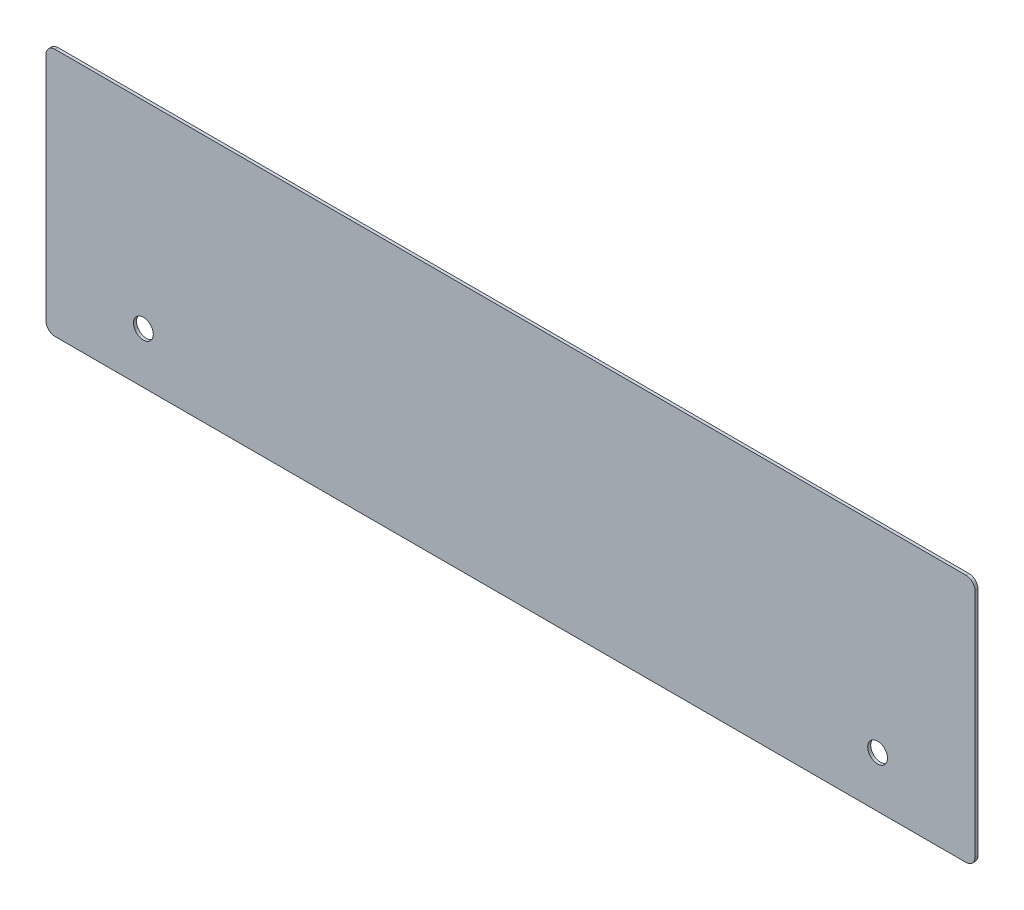
ISO-10303-21;
HEADER;
FILE_DESCRIPTION(('STEP AP214'),'2;1');
FILE_NAME('part.step','',(''),(''),'','','');
FILE_SCHEMA(('AUTOMOTIVE_DESIGN { 1 0 10303 214 1 1 1 1 }'));
ENDSEC;
DATA;
#1=APPLICATION_CONTEXT('core data for automotive mechanical design processes');
#2=APPLICATION_PROTOCOL_DEFINITION('international standard','automotive_design',2000,#1);
#3=PRODUCT_CONTEXT('',#1,'mechanical');
#4=PRODUCT('Part','Part','',(#3));
#5=PRODUCT_RELATED_PRODUCT_CATEGORY('part','',(#4));
#6=PRODUCT_DEFINITION_FORMATION('','',#4);
#7=PRODUCT_DEFINITION_CONTEXT('part definition',#1,'design');
#8=PRODUCT_DEFINITION('design','',#6,#7);
#9=PRODUCT_DEFINITION_SHAPE('','',#8);
#10=(LENGTH_UNIT() NAMED_UNIT(*) SI_UNIT(.MILLI.,.METRE.));
#11=(NAMED_UNIT(*) PLANE_ANGLE_UNIT() SI_UNIT($,.RADIAN.));
#12=(NAMED_UNIT(*) SI_UNIT($,.STERADIAN.) SOLID_ANGLE_UNIT());
#13=UNCERTAINTY_MEASURE_WITH_UNIT(LENGTH_MEASURE(1.E-05),#10,'distance_accuracy_value','');
#14=(GEOMETRIC_REPRESENTATION_CONTEXT(3) GLOBAL_UNCERTAINTY_ASSIGNED_CONTEXT((#13)) GLOBAL_UNIT_ASSIGNED_CONTEXT((#10,
#11,#12)) REPRESENTATION_CONTEXT('',''));
#15=CARTESIAN_POINT('',(0.,0.,0.));
#16=DIRECTION('',(0.,0.,1.));
#17=DIRECTION('',(1.,0.,0.));
#18=AXIS2_PLACEMENT_3D('',#15,#16,#17);
#19=CARTESIAN_POINT('',(155.,-41.5,-1.));
#20=DIRECTION('',(1.,0.,0.));
#21=DIRECTION('',(0.,0.,-1.));
#22=AXIS2_PLACEMENT_3D('',#19,#20,#21);
#23=PLANE('',#22);
#24=DIRECTION('',(0.,1.,0.));
#25=VECTOR('',#24,1.);
#26=CARTESIAN_POINT('',(155.,-41.5,0.));
#27=LINE('',#26,#25);
#28=CARTESIAN_POINT('',(155.,-38.5,0.));
#29=VERTEX_POINT('',#28);
#30=CARTESIAN_POINT('',(155.,38.5,0.));
#31=VERTEX_POINT('',#30);
#32=EDGE_CURVE('E110',#29,#31,#27,.T.);
#33=ORIENTED_EDGE('',*,*,#32,.F.);
#34=DIRECTION('',(0.,0.,1.));
#35=VECTOR('',#34,1.);
#36=CARTESIAN_POINT('',(155.,-38.5,-1.));
#37=LINE('',#36,#35);
#38=CARTESIAN_POINT('',(155.,-38.5,-1.));
#39=VERTEX_POINT('',#38);
#40=EDGE_CURVE('E11',#29,#39,#37,.F.);
#41=ORIENTED_EDGE('',*,*,#40,.T.);
#42=DIRECTION('',(0.,1.,0.));
#43=VECTOR('',#42,1.);
#44=CARTESIAN_POINT('',(155.,-41.5,-1.));
#45=LINE('',#44,#43);
#46=CARTESIAN_POINT('',(155.,38.5,-1.));
#47=VERTEX_POINT('',#46);
#48=EDGE_CURVE('E160',#39,#47,#45,.T.);
#49=ORIENTED_EDGE('',*,*,#48,.T.);
#50=DIRECTION('',(0.,0.,1.));
#51=VECTOR('',#50,1.);
#52=CARTESIAN_POINT('',(155.,38.5,-1.));
#53=LINE('',#52,#51);
#54=EDGE_CURVE('E47',#47,#31,#53,.T.);
#55=ORIENTED_EDGE('',*,*,#54,.T.);
#56=EDGE_LOOP('',(#33,#41,#49,#55));
#57=FACE_BOUND('',#56,.T.);
#58=ADVANCED_FACE('F39',(#57),#23,.T.);
#59=CARTESIAN_POINT('',(-155.,-41.5,-1.));
#60=DIRECTION('',(0.,-1.,0.));
#61=DIRECTION('',(0.,0.,-1.));
#62=AXIS2_PLACEMENT_3D('',#59,#60,#61);
#63=PLANE('',#62);
#64=DIRECTION('',(1.,0.,0.));
#65=VECTOR('',#64,1.);
#66=CARTESIAN_POINT('',(-155.,-41.5,0.));
#67=LINE('',#66,#65);
#68=CARTESIAN_POINT('',(-152.,-41.5,0.));
#69=VERTEX_POINT('',#68);
#70=CARTESIAN_POINT('',(152.,-41.5,0.));
#71=VERTEX_POINT('',#70);
#72=EDGE_CURVE('E135',#69,#71,#67,.T.);
#73=ORIENTED_EDGE('',*,*,#72,.F.);
#74=DIRECTION('',(0.,0.,1.));
#75=VECTOR('',#74,1.);
#76=CARTESIAN_POINT('',(-152.,-41.5,-1.));
#77=LINE('',#76,#75);
#78=CARTESIAN_POINT('',(-152.,-41.5,-1.));
#79=VERTEX_POINT('',#78);
#80=EDGE_CURVE('E61',#69,#79,#77,.F.);
#81=ORIENTED_EDGE('',*,*,#80,.T.);
#82=DIRECTION('',(1.,0.,0.));
#83=VECTOR('',#82,1.);
#84=CARTESIAN_POINT('',(-155.,-41.5,-1.));
#85=LINE('',#84,#83);
#86=CARTESIAN_POINT('',(152.,-41.5,-1.));
#87=VERTEX_POINT('',#86);
#88=EDGE_CURVE('E129',#79,#87,#85,.T.);
#89=ORIENTED_EDGE('',*,*,#88,.T.);
#90=DIRECTION('',(0.,0.,1.));
#91=VECTOR('',#90,1.);
#92=CARTESIAN_POINT('',(152.,-41.5,-1.));
#93=LINE('',#92,#91);
#94=EDGE_CURVE('E154',#87,#71,#93,.T.);
#95=ORIENTED_EDGE('',*,*,#94,.T.);
#96=EDGE_LOOP('',(#73,#81,#89,#95));
#97=FACE_BOUND('',#96,.T.);
#98=ADVANCED_FACE('F195',(#97),#63,.T.);
#99=CARTESIAN_POINT('',(-155.,-41.5,-1.));
#100=DIRECTION('',(-1.,0.,0.));
#101=DIRECTION('',(0.,0.,1.));
#102=AXIS2_PLACEMENT_3D('',#99,#100,#101);
#103=PLANE('',#102);
#104=DIRECTION('',(0.,-1.,0.));
#105=VECTOR('',#104,1.);
#106=CARTESIAN_POINT('',(-155.,-41.5,0.));
#107=LINE('',#106,#105);
#108=CARTESIAN_POINT('',(-155.,38.5,0.));
#109=VERTEX_POINT('',#108);
#110=CARTESIAN_POINT('',(-155.,-38.5,0.));
#111=VERTEX_POINT('',#110);
#112=EDGE_CURVE('E125',#109,#111,#107,.T.);
#113=ORIENTED_EDGE('',*,*,#112,.F.);
#114=DIRECTION('',(0.,0.,1.));
#115=VECTOR('',#114,1.);
#116=CARTESIAN_POINT('',(-155.,38.5,-1.));
#117=LINE('',#116,#115);
#118=CARTESIAN_POINT('',(-155.,38.5,-1.));
#119=VERTEX_POINT('',#118);
#120=EDGE_CURVE('E146',#109,#119,#117,.F.);
#121=ORIENTED_EDGE('',*,*,#120,.T.);
#122=DIRECTION('',(0.,-1.,0.));
#123=VECTOR('',#122,1.);
#124=CARTESIAN_POINT('',(-155.,-41.5,-1.));
#125=LINE('',#124,#123);
#126=CARTESIAN_POINT('',(-155.,-38.5,-1.));
#127=VERTEX_POINT('',#126);
#128=EDGE_CURVE('E132',#119,#127,#125,.T.);
#129=ORIENTED_EDGE('',*,*,#128,.T.);
#130=DIRECTION('',(0.,0.,1.));
#131=VECTOR('',#130,1.);
#132=CARTESIAN_POINT('',(-155.,-38.5,-1.));
#133=LINE('',#132,#131);
#134=EDGE_CURVE('E143',#127,#111,#133,.T.);
#135=ORIENTED_EDGE('',*,*,#134,.T.);
#136=EDGE_LOOP('',(#113,#121,#129,#135));
#137=FACE_BOUND('',#136,.T.);
#138=ADVANCED_FACE('F175',(#137),#103,.T.);
#139=CARTESIAN_POINT('',(-155.,41.5,-1.));
#140=DIRECTION('',(0.,1.,0.));
#141=DIRECTION('',(0.,0.,1.));
#142=AXIS2_PLACEMENT_3D('',#139,#140,#141);
#143=PLANE('',#142);
#144=DIRECTION('',(-1.,0.,0.));
#145=VECTOR('',#144,1.);
#146=CARTESIAN_POINT('',(-155.,41.5,-1.));
#147=LINE('',#146,#145);
#148=CARTESIAN_POINT('',(152.,41.5,-1.));
#149=VERTEX_POINT('',#148);
#150=CARTESIAN_POINT('',(-152.,41.5,-1.));
#151=VERTEX_POINT('',#150);
#152=EDGE_CURVE('E161',#149,#151,#147,.T.);
#153=ORIENTED_EDGE('',*,*,#152,.T.);
#154=DIRECTION('',(0.,0.,1.));
#155=VECTOR('',#154,1.);
#156=CARTESIAN_POINT('',(-152.,41.5,-1.));
#157=LINE('',#156,#155);
#158=CARTESIAN_POINT('',(-152.,41.5,0.));
#159=VERTEX_POINT('',#158);
#160=EDGE_CURVE('E116',#151,#159,#157,.T.);
#161=ORIENTED_EDGE('',*,*,#160,.T.);
#162=DIRECTION('',(-1.,0.,0.));
#163=VECTOR('',#162,1.);
#164=CARTESIAN_POINT('',(-155.,41.5,0.));
#165=LINE('',#164,#163);
#166=CARTESIAN_POINT('',(152.,41.5,0.));
#167=VERTEX_POINT('',#166);
#168=EDGE_CURVE('E108',#167,#159,#165,.T.);
#169=ORIENTED_EDGE('',*,*,#168,.F.);
#170=DIRECTION('',(0.,0.,1.));
#171=VECTOR('',#170,1.);
#172=CARTESIAN_POINT('',(152.,41.5,-1.));
#173=LINE('',#172,#171);
#174=EDGE_CURVE('E122',#167,#149,#173,.F.);
#175=ORIENTED_EDGE('',*,*,#174,.T.);
#176=EDGE_LOOP('',(#153,#161,#169,#175));
#177=FACE_BOUND('',#176,.T.);
#178=ADVANCED_FACE('F121',(#177),#143,.T.);
#179=CARTESIAN_POINT('',(0.,0.,-1.));
#180=DIRECTION('',(0.,0.,-1.));
#181=DIRECTION('',(-1.,0.,0.));
#182=AXIS2_PLACEMENT_3D('',#179,#180,#181);
#183=PLANE('',#182);
#184=CARTESIAN_POINT('',(-122.5,-24.493378467745,-0.999999999999999));
#185=DIRECTION('',(0.,0.,-1.));
#186=DIRECTION('',(-1.,0.,0.));
#187=AXIS2_PLACEMENT_3D('',#184,#185,#186);
#188=CIRCLE('',#187,3.3);
#189=CARTESIAN_POINT('',(-125.8,-24.493378467745,-0.999999999999999));
#190=VERTEX_POINT('',#189);
#191=EDGE_CURVE('E224',#190,#190,#188,.T.);
#192=ORIENTED_EDGE('',*,*,#191,.F.);
#193=EDGE_LOOP('',(#192));
#194=FACE_BOUND('',#193,.T.);
#195=CARTESIAN_POINT('',(122.5,-24.493378467745,-0.999999999999999));
#196=DIRECTION('',(0.,0.,-1.));
#197=DIRECTION('',(-1.,0.,0.));
#198=AXIS2_PLACEMENT_3D('',#195,#196,#197);
#199=CIRCLE('',#198,3.3);
#200=CARTESIAN_POINT('',(119.2,-24.493378467745,-0.999999999999999));
#201=VERTEX_POINT('',#200);
#202=EDGE_CURVE('E166',#201,#201,#199,.T.);
#203=ORIENTED_EDGE('',*,*,#202,.F.);
#204=EDGE_LOOP('',(#203));
#205=FACE_BOUND('',#204,.T.);
#206=ORIENTED_EDGE('',*,*,#128,.F.);
#207=CARTESIAN_POINT('',(-152.,38.5,-1.));
#208=DIRECTION('',(0.,0.,-1.));
#209=DIRECTION('',(-1.,0.,0.));
#210=AXIS2_PLACEMENT_3D('',#207,#208,#209);
#211=CIRCLE('',#210,3.);
#212=EDGE_CURVE('E152',#119,#151,#211,.T.);
#213=ORIENTED_EDGE('',*,*,#212,.T.);
#214=ORIENTED_EDGE('',*,*,#152,.F.);
#215=CARTESIAN_POINT('',(152.,38.5,-1.));
#216=DIRECTION('',(0.,0.,-1.));
#217=DIRECTION('',(-1.,0.,0.));
#218=AXIS2_PLACEMENT_3D('',#215,#216,#217);
#219=CIRCLE('',#218,3.);
#220=EDGE_CURVE('E128',#149,#47,#219,.T.);
#221=ORIENTED_EDGE('',*,*,#220,.T.);
#222=ORIENTED_EDGE('',*,*,#48,.F.);
#223=CARTESIAN_POINT('',(152.,-38.5,-1.));
#224=DIRECTION('',(0.,0.,-1.));
#225=DIRECTION('',(-1.,0.,0.));
#226=AXIS2_PLACEMENT_3D('',#223,#224,#225);
#227=CIRCLE('',#226,3.);
#228=EDGE_CURVE('E54',#39,#87,#227,.T.);
#229=ORIENTED_EDGE('',*,*,#228,.T.);
#230=ORIENTED_EDGE('',*,*,#88,.F.);
#231=CARTESIAN_POINT('',(-152.,-38.5,-1.));
#232=DIRECTION('',(0.,0.,-1.));
#233=DIRECTION('',(-1.,0.,0.));
#234=AXIS2_PLACEMENT_3D('',#231,#232,#233);
#235=CIRCLE('',#234,3.);
#236=EDGE_CURVE('E150',#79,#127,#235,.T.);
#237=ORIENTED_EDGE('',*,*,#236,.T.);
#238=EDGE_LOOP('',(#206,#213,#214,#221,#222,#229,#230,#237));
#239=FACE_BOUND('',#238,.T.);
#240=ADVANCED_FACE('F181',(#194,#205,#239),#183,.T.);
#241=CARTESIAN_POINT('',(0.,0.,0.));
#242=DIRECTION('',(0.,0.,-1.));
#243=DIRECTION('',(-1.,0.,0.));
#244=AXIS2_PLACEMENT_3D('',#241,#242,#243);
#245=PLANE('',#244);
#246=CARTESIAN_POINT('',(-122.5,-24.493378467745,0.));
#247=DIRECTION('',(0.,0.,1.));
#248=DIRECTION('',(1.,0.,0.));
#249=AXIS2_PLACEMENT_3D('',#246,#247,#248);
#250=CIRCLE('',#249,3.3);
#251=CARTESIAN_POINT('',(-119.2,-24.493378467745,0.));
#252=VERTEX_POINT('',#251);
#253=EDGE_CURVE('E227',#252,#252,#250,.T.);
#254=ORIENTED_EDGE('',*,*,#253,.F.);
#255=EDGE_LOOP('',(#254));
#256=FACE_BOUND('',#255,.T.);
#257=CARTESIAN_POINT('',(122.5,-24.493378467745,0.));
#258=DIRECTION('',(0.,0.,1.));
#259=DIRECTION('',(1.,0.,0.));
#260=AXIS2_PLACEMENT_3D('',#257,#258,#259);
#261=CIRCLE('',#260,3.3);
#262=CARTESIAN_POINT('',(125.8,-24.493378467745,0.));
#263=VERTEX_POINT('',#262);
#264=EDGE_CURVE('E229',#263,#263,#261,.T.);
#265=ORIENTED_EDGE('',*,*,#264,.F.);
#266=EDGE_LOOP('',(#265));
#267=FACE_BOUND('',#266,.T.);
#268=ORIENTED_EDGE('',*,*,#168,.T.);
#269=CARTESIAN_POINT('',(-152.,38.5,0.));
#270=DIRECTION('',(0.,0.,-1.));
#271=DIRECTION('',(-1.,0.,0.));
#272=AXIS2_PLACEMENT_3D('',#269,#270,#271);
#273=CIRCLE('',#272,3.);
#274=EDGE_CURVE('E141',#159,#109,#273,.F.);
#275=ORIENTED_EDGE('',*,*,#274,.T.);
#276=ORIENTED_EDGE('',*,*,#112,.T.);
#277=CARTESIAN_POINT('',(-152.,-38.5,0.));
#278=DIRECTION('',(0.,0.,-1.));
#279=DIRECTION('',(-1.,0.,0.));
#280=AXIS2_PLACEMENT_3D('',#277,#278,#279);
#281=CIRCLE('',#280,3.);
#282=EDGE_CURVE('E139',#111,#69,#281,.F.);
#283=ORIENTED_EDGE('',*,*,#282,.T.);
#284=ORIENTED_EDGE('',*,*,#72,.T.);
#285=CARTESIAN_POINT('',(152.,-38.5,0.));
#286=DIRECTION('',(0.,0.,-1.));
#287=DIRECTION('',(-1.,0.,0.));
#288=AXIS2_PLACEMENT_3D('',#285,#286,#287);
#289=CIRCLE('',#288,3.);
#290=EDGE_CURVE('E115',#71,#29,#289,.F.);
#291=ORIENTED_EDGE('',*,*,#290,.T.);
#292=ORIENTED_EDGE('',*,*,#32,.T.);
#293=CARTESIAN_POINT('',(152.,38.5,0.));
#294=DIRECTION('',(0.,0.,-1.));
#295=DIRECTION('',(-1.,0.,0.));
#296=AXIS2_PLACEMENT_3D('',#293,#294,#295);
#297=CIRCLE('',#296,3.);
#298=EDGE_CURVE('E105',#31,#167,#297,.F.);
#299=ORIENTED_EDGE('',*,*,#298,.T.);
#300=EDGE_LOOP('',(#268,#275,#276,#283,#284,#291,#292,#299));
#301=FACE_BOUND('',#300,.T.);
#302=ADVANCED_FACE('F107',(#256,#267,#301),#245,.F.);
#303=CARTESIAN_POINT('',(-152.,38.5,-1.));
#304=DIRECTION('',(0.,0.,1.));
#305=DIRECTION('',(1.,0.,0.));
#306=AXIS2_PLACEMENT_3D('',#303,#304,#305);
#307=CYLINDRICAL_SURFACE('',#306,3.);
#308=ORIENTED_EDGE('',*,*,#212,.F.);
#309=ORIENTED_EDGE('',*,*,#120,.F.);
#310=ORIENTED_EDGE('',*,*,#274,.F.);
#311=ORIENTED_EDGE('',*,*,#160,.F.);
#312=EDGE_LOOP('',(#308,#309,#310,#311));
#313=FACE_BOUND('',#312,.T.);
#314=ADVANCED_FACE('F180',(#313),#307,.T.);
#315=CARTESIAN_POINT('',(-152.,-38.5,-1.));
#316=DIRECTION('',(0.,0.,1.));
#317=DIRECTION('',(1.,0.,0.));
#318=AXIS2_PLACEMENT_3D('',#315,#316,#317);
#319=CYLINDRICAL_SURFACE('',#318,3.);
#320=ORIENTED_EDGE('',*,*,#236,.F.);
#321=ORIENTED_EDGE('',*,*,#80,.F.);
#322=ORIENTED_EDGE('',*,*,#282,.F.);
#323=ORIENTED_EDGE('',*,*,#134,.F.);
#324=EDGE_LOOP('',(#320,#321,#322,#323));
#325=FACE_BOUND('',#324,.T.);
#326=ADVANCED_FACE('F184',(#325),#319,.T.);
#327=CARTESIAN_POINT('',(152.,-38.5,-1.));
#328=DIRECTION('',(0.,0.,1.));
#329=DIRECTION('',(1.,0.,0.));
#330=AXIS2_PLACEMENT_3D('',#327,#328,#329);
#331=CYLINDRICAL_SURFACE('',#330,3.);
#332=ORIENTED_EDGE('',*,*,#228,.F.);
#333=ORIENTED_EDGE('',*,*,#40,.F.);
#334=ORIENTED_EDGE('',*,*,#290,.F.);
#335=ORIENTED_EDGE('',*,*,#94,.F.);
#336=EDGE_LOOP('',(#332,#333,#334,#335));
#337=FACE_BOUND('',#336,.T.);
#338=ADVANCED_FACE('F186',(#337),#331,.T.);
#339=CARTESIAN_POINT('',(152.,38.5,-1.));
#340=DIRECTION('',(0.,0.,1.));
#341=DIRECTION('',(1.,0.,0.));
#342=AXIS2_PLACEMENT_3D('',#339,#340,#341);
#343=CYLINDRICAL_SURFACE('',#342,3.);
#344=ORIENTED_EDGE('',*,*,#220,.F.);
#345=ORIENTED_EDGE('',*,*,#174,.F.);
#346=ORIENTED_EDGE('',*,*,#298,.F.);
#347=ORIENTED_EDGE('',*,*,#54,.F.);
#348=EDGE_LOOP('',(#344,#345,#346,#347));
#349=FACE_BOUND('',#348,.T.);
#350=ADVANCED_FACE('F41',(#349),#343,.T.);
#351=CARTESIAN_POINT('',(122.5,-24.493378467745,-10.));
#352=DIRECTION('',(0.,0.,1.));
#353=DIRECTION('',(1.,0.,0.));
#354=AXIS2_PLACEMENT_3D('',#351,#352,#353);
#355=CYLINDRICAL_SURFACE('',#354,3.3);
#356=ORIENTED_EDGE('',*,*,#202,.T.);
#357=EDGE_LOOP('',(#356));
#358=FACE_BOUND('',#357,.T.);
#359=ORIENTED_EDGE('',*,*,#264,.T.);
#360=EDGE_LOOP('',(#359));
#361=FACE_BOUND('',#360,.T.);
#362=ADVANCED_FACE('F212',(#358,#361),#355,.F.);
#363=CARTESIAN_POINT('',(-122.5,-24.493378467745,-10.));
#364=DIRECTION('',(0.,0.,1.));
#365=DIRECTION('',(1.,0.,0.));
#366=AXIS2_PLACEMENT_3D('',#363,#364,#365);
#367=CYLINDRICAL_SURFACE('',#366,3.3);
#368=ORIENTED_EDGE('',*,*,#191,.T.);
#369=EDGE_LOOP('',(#368));
#370=FACE_BOUND('',#369,.T.);
#371=ORIENTED_EDGE('',*,*,#253,.T.);
#372=EDGE_LOOP('',(#371));
#373=FACE_BOUND('',#372,.T.);
#374=ADVANCED_FACE('F215',(#370,#373),#367,.F.);
#375=CLOSED_SHELL('',(#58,#98,#138,#178,#240,#302,#314,#326,#338,#350,#362,#374));
#376=MANIFOLD_SOLID_BREP('B2',#375);
#377=ADVANCED_BREP_SHAPE_REPRESENTATION('',(#18,#376),#14);
#378=SHAPE_DEFINITION_REPRESENTATION(#9,#377);
ENDSEC;
END-ISO-10303-21;
